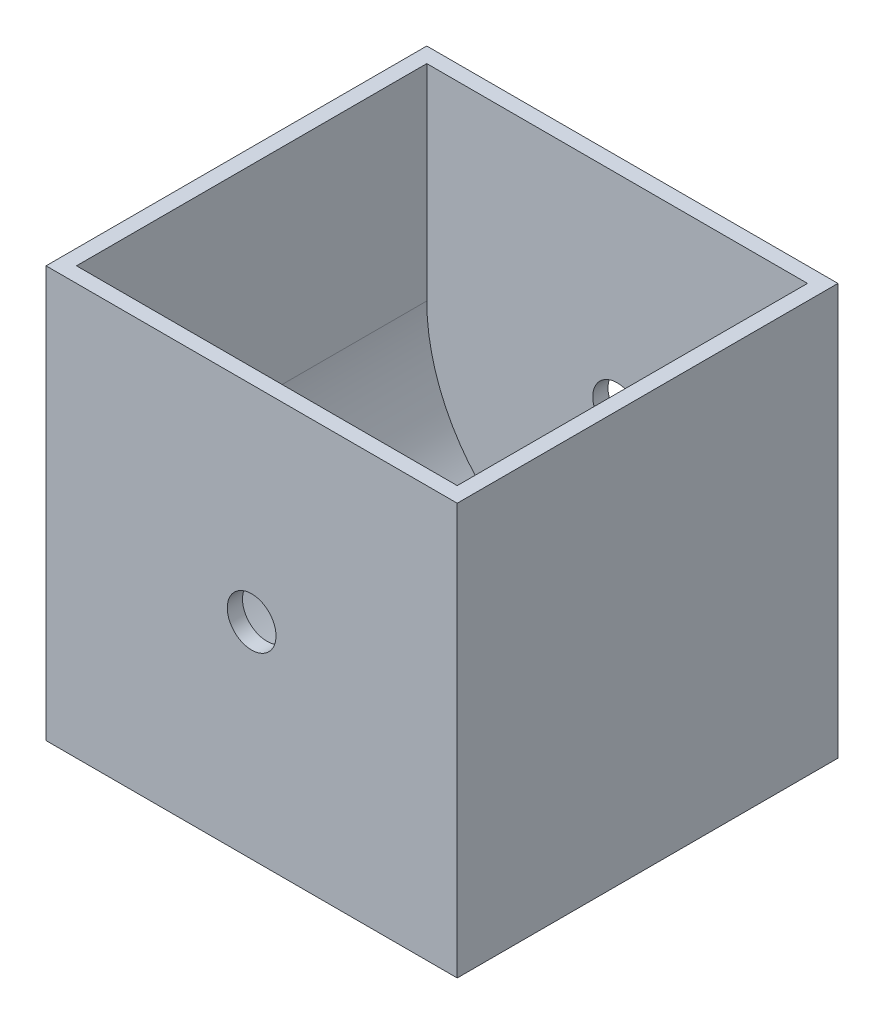
ISO-10303-21;
HEADER;
FILE_DESCRIPTION(('STEP AP214'),'2;1');
FILE_NAME('part.step','',(''),(''),'','','');
FILE_SCHEMA(('AUTOMOTIVE_DESIGN { 1 0 10303 214 1 1 1 1 }'));
ENDSEC;
DATA;
#1=APPLICATION_CONTEXT('core data for automotive mechanical design processes');
#2=APPLICATION_PROTOCOL_DEFINITION('international standard','automotive_design',2000,#1);
#3=PRODUCT_CONTEXT('',#1,'mechanical');
#4=PRODUCT('Part','Part','',(#3));
#5=PRODUCT_RELATED_PRODUCT_CATEGORY('part','',(#4));
#6=PRODUCT_DEFINITION_FORMATION('','',#4);
#7=PRODUCT_DEFINITION_CONTEXT('part definition',#1,'design');
#8=PRODUCT_DEFINITION('design','',#6,#7);
#9=PRODUCT_DEFINITION_SHAPE('','',#8);
#10=(LENGTH_UNIT() NAMED_UNIT(*) SI_UNIT(.MILLI.,.METRE.));
#11=(NAMED_UNIT(*) PLANE_ANGLE_UNIT() SI_UNIT($,.RADIAN.));
#12=(NAMED_UNIT(*) SI_UNIT($,.STERADIAN.) SOLID_ANGLE_UNIT());
#13=UNCERTAINTY_MEASURE_WITH_UNIT(LENGTH_MEASURE(1.E-05),#10,'distance_accuracy_value','');
#14=(GEOMETRIC_REPRESENTATION_CONTEXT(3) GLOBAL_UNCERTAINTY_ASSIGNED_CONTEXT((#13)) GLOBAL_UNIT_ASSIGNED_CONTEXT((#10,
#11,#12)) REPRESENTATION_CONTEXT('',''));
#15=CARTESIAN_POINT('',(0.,0.,0.));
#16=DIRECTION('',(0.,0.,1.));
#17=DIRECTION('',(1.,0.,0.));
#18=AXIS2_PLACEMENT_3D('',#15,#16,#17);
#19=CARTESIAN_POINT('',(0.,0.,-5.));
#20=DIRECTION('',(0.,-1.,0.));
#21=DIRECTION('',(1.,0.,0.));
#22=AXIS2_PLACEMENT_3D('',#19,#20,#21);
#23=PLANE('',#22);
#24=DIRECTION('',(0.,0.,1.));
#25=VECTOR('',#24,1.);
#26=CARTESIAN_POINT('',(135.,0.,-5.));
#27=LINE('',#26,#25);
#28=CARTESIAN_POINT('',(135.,0.,-5.));
#29=VERTEX_POINT('',#28);
#30=CARTESIAN_POINT('',(135.,0.,120.));
#31=VERTEX_POINT('',#30);
#32=EDGE_CURVE('E177',#29,#31,#27,.T.);
#33=ORIENTED_EDGE('',*,*,#32,.T.);
#34=DIRECTION('',(1.,0.,0.));
#35=VECTOR('',#34,1.);
#36=CARTESIAN_POINT('',(0.,0.,120.));
#37=LINE('',#36,#35);
#38=CARTESIAN_POINT('',(0.,0.,120.));
#39=VERTEX_POINT('',#38);
#40=EDGE_CURVE('E151',#39,#31,#37,.T.);
#41=ORIENTED_EDGE('',*,*,#40,.F.);
#42=DIRECTION('',(0.,0.,1.));
#43=VECTOR('',#42,1.);
#44=CARTESIAN_POINT('',(0.,0.,-5.));
#45=LINE('',#44,#43);
#46=CARTESIAN_POINT('',(0.,0.,-5.));
#47=VERTEX_POINT('',#46);
#48=EDGE_CURVE('E12',#47,#39,#45,.T.);
#49=ORIENTED_EDGE('',*,*,#48,.F.);
#50=DIRECTION('',(1.,0.,0.));
#51=VECTOR('',#50,1.);
#52=CARTESIAN_POINT('',(0.,0.,-5.));
#53=LINE('',#52,#51);
#54=EDGE_CURVE('E167',#47,#29,#53,.T.);
#55=ORIENTED_EDGE('',*,*,#54,.T.);
#56=EDGE_LOOP('',(#33,#41,#49,#55));
#57=FACE_BOUND('',#56,.T.);
#58=ADVANCED_FACE('F54',(#57),#23,.T.);
#59=CARTESIAN_POINT('',(0.,0.,-5.));
#60=DIRECTION('',(1.,0.,0.));
#61=DIRECTION('',(0.,0.,-1.));
#62=AXIS2_PLACEMENT_3D('',#59,#60,#61);
#63=PLANE('',#62);
#64=ORIENTED_EDGE('',*,*,#48,.T.);
#65=DIRECTION('',(0.,1.,0.));
#66=VECTOR('',#65,1.);
#67=CARTESIAN_POINT('',(0.,0.,120.));
#68=LINE('',#67,#66);
#69=CARTESIAN_POINT('',(0.,135.,120.));
#70=VERTEX_POINT('',#69);
#71=EDGE_CURVE('E160',#39,#70,#68,.T.);
#72=ORIENTED_EDGE('',*,*,#71,.T.);
#73=DIRECTION('',(0.,0.,1.));
#74=VECTOR('',#73,1.);
#75=CARTESIAN_POINT('',(0.,135.,-5.));
#76=LINE('',#75,#74);
#77=CARTESIAN_POINT('',(0.,135.,-5.));
#78=VERTEX_POINT('',#77);
#79=EDGE_CURVE('E63',#78,#70,#76,.T.);
#80=ORIENTED_EDGE('',*,*,#79,.F.);
#81=DIRECTION('',(0.,1.,0.));
#82=VECTOR('',#81,1.);
#83=CARTESIAN_POINT('',(0.,0.,-5.));
#84=LINE('',#83,#82);
#85=EDGE_CURVE('E174',#47,#78,#84,.T.);
#86=ORIENTED_EDGE('',*,*,#85,.F.);
#87=EDGE_LOOP('',(#64,#72,#80,#86));
#88=FACE_BOUND('',#87,.T.);
#89=ADVANCED_FACE('F194',(#88),#63,.F.);
#90=CARTESIAN_POINT('',(0.,135.,-5.));
#91=DIRECTION('',(0.,-1.,0.));
#92=DIRECTION('',(1.,0.,0.));
#93=AXIS2_PLACEMENT_3D('',#90,#91,#92);
#94=PLANE('',#93);
#95=DIRECTION('',(0.,0.,1.));
#96=VECTOR('',#95,1.);
#97=CARTESIAN_POINT('',(5.00000000000002,135.,0.));
#98=LINE('',#97,#96);
#99=CARTESIAN_POINT('',(5.00000000000002,135.,0.));
#100=VERTEX_POINT('',#99);
#101=CARTESIAN_POINT('',(5.00000000000002,135.,115.));
#102=VERTEX_POINT('',#101);
#103=EDGE_CURVE('E142',#100,#102,#98,.T.);
#104=ORIENTED_EDGE('',*,*,#103,.F.);
#105=DIRECTION('',(-1.,0.,0.));
#106=VECTOR('',#105,1.);
#107=CARTESIAN_POINT('',(130.,135.,0.));
#108=LINE('',#107,#106);
#109=CARTESIAN_POINT('',(130.,135.,0.));
#110=VERTEX_POINT('',#109);
#111=EDGE_CURVE('E71',#110,#100,#108,.T.);
#112=ORIENTED_EDGE('',*,*,#111,.F.);
#113=DIRECTION('',(0.,0.,1.));
#114=VECTOR('',#113,1.);
#115=CARTESIAN_POINT('',(130.,135.,0.));
#116=LINE('',#115,#114);
#117=CARTESIAN_POINT('',(130.,135.,115.));
#118=VERTEX_POINT('',#117);
#119=EDGE_CURVE('E130',#110,#118,#116,.T.);
#120=ORIENTED_EDGE('',*,*,#119,.T.);
#121=DIRECTION('',(-1.,0.,0.));
#122=VECTOR('',#121,1.);
#123=CARTESIAN_POINT('',(130.,135.,115.));
#124=LINE('',#123,#122);
#125=EDGE_CURVE('E255',#118,#102,#124,.T.);
#126=ORIENTED_EDGE('',*,*,#125,.T.);
#127=EDGE_LOOP('',(#104,#112,#120,#126));
#128=FACE_BOUND('',#127,.T.);
#129=ORIENTED_EDGE('',*,*,#79,.T.);
#130=DIRECTION('',(1.,0.,0.));
#131=VECTOR('',#130,1.);
#132=CARTESIAN_POINT('',(0.,135.,120.));
#133=LINE('',#132,#131);
#134=CARTESIAN_POINT('',(135.,135.,120.));
#135=VERTEX_POINT('',#134);
#136=EDGE_CURVE('E157',#70,#135,#133,.T.);
#137=ORIENTED_EDGE('',*,*,#136,.T.);
#138=DIRECTION('',(0.,0.,1.));
#139=VECTOR('',#138,1.);
#140=CARTESIAN_POINT('',(135.,135.,-5.));
#141=LINE('',#140,#139);
#142=CARTESIAN_POINT('',(135.,135.,-5.));
#143=VERTEX_POINT('',#142);
#144=EDGE_CURVE('E181',#143,#135,#141,.T.);
#145=ORIENTED_EDGE('',*,*,#144,.F.);
#146=DIRECTION('',(1.,0.,0.));
#147=VECTOR('',#146,1.);
#148=CARTESIAN_POINT('',(0.,135.,-5.));
#149=LINE('',#148,#147);
#150=EDGE_CURVE('E172',#78,#143,#149,.T.);
#151=ORIENTED_EDGE('',*,*,#150,.F.);
#152=EDGE_LOOP('',(#129,#137,#145,#151));
#153=FACE_BOUND('',#152,.T.);
#154=ADVANCED_FACE('F198',(#128,#153),#94,.F.);
#155=CARTESIAN_POINT('',(67.5,67.5,-5.));
#156=DIRECTION('',(0.,0.,1.));
#157=DIRECTION('',(1.,0.,0.));
#158=AXIS2_PLACEMENT_3D('',#155,#156,#157);
#159=CYLINDRICAL_SURFACE('',#158,7.99999999999999);
#160=CARTESIAN_POINT('',(67.5,67.5,-5.));
#161=DIRECTION('',(0.,0.,1.));
#162=DIRECTION('',(1.,0.,0.));
#163=AXIS2_PLACEMENT_3D('',#160,#161,#162);
#164=CIRCLE('',#163,7.99999999999999);
#165=CARTESIAN_POINT('',(75.5,67.5,-5.));
#166=VERTEX_POINT('',#165);
#167=EDGE_CURVE('E164',#166,#166,#164,.T.);
#168=ORIENTED_EDGE('',*,*,#167,.F.);
#169=EDGE_LOOP('',(#168));
#170=FACE_BOUND('',#169,.T.);
#171=CARTESIAN_POINT('',(67.5,67.5,0.));
#172=DIRECTION('',(0.,0.,1.));
#173=DIRECTION('',(1.,0.,0.));
#174=AXIS2_PLACEMENT_3D('',#171,#172,#173);
#175=CIRCLE('',#174,7.99999999999999);
#176=CARTESIAN_POINT('',(75.5,67.5,0.));
#177=VERTEX_POINT('',#176);
#178=EDGE_CURVE('E163',#177,#177,#175,.T.);
#179=ORIENTED_EDGE('',*,*,#178,.T.);
#180=EDGE_LOOP('',(#179));
#181=FACE_BOUND('',#180,.T.);
#182=ADVANCED_FACE('F56',(#170,#181),#159,.F.);
#183=CARTESIAN_POINT('',(135.,0.,-5.));
#184=DIRECTION('',(1.,0.,0.));
#185=DIRECTION('',(0.,1.,0.));
#186=AXIS2_PLACEMENT_3D('',#183,#184,#185);
#187=PLANE('',#186);
#188=ORIENTED_EDGE('',*,*,#144,.T.);
#189=DIRECTION('',(0.,1.,0.));
#190=VECTOR('',#189,1.);
#191=CARTESIAN_POINT('',(135.,0.,120.));
#192=LINE('',#191,#190);
#193=EDGE_CURVE('E154',#31,#135,#192,.T.);
#194=ORIENTED_EDGE('',*,*,#193,.F.);
#195=ORIENTED_EDGE('',*,*,#32,.F.);
#196=DIRECTION('',(0.,1.,0.));
#197=VECTOR('',#196,1.);
#198=CARTESIAN_POINT('',(135.,0.,-5.));
#199=LINE('',#198,#197);
#200=EDGE_CURVE('E169',#29,#143,#199,.T.);
#201=ORIENTED_EDGE('',*,*,#200,.T.);
#202=EDGE_LOOP('',(#188,#194,#195,#201));
#203=FACE_BOUND('',#202,.T.);
#204=ADVANCED_FACE('F187',(#203),#187,.T.);
#205=CARTESIAN_POINT('',(0.,0.,-5.));
#206=DIRECTION('',(0.,0.,1.));
#207=DIRECTION('',(1.,0.,0.));
#208=AXIS2_PLACEMENT_3D('',#205,#206,#207);
#209=PLANE('',#208);
#210=ORIENTED_EDGE('',*,*,#167,.T.);
#211=EDGE_LOOP('',(#210));
#212=FACE_BOUND('',#211,.T.);
#213=ORIENTED_EDGE('',*,*,#54,.F.);
#214=ORIENTED_EDGE('',*,*,#85,.T.);
#215=ORIENTED_EDGE('',*,*,#150,.T.);
#216=ORIENTED_EDGE('',*,*,#200,.F.);
#217=EDGE_LOOP('',(#213,#214,#215,#216));
#218=FACE_BOUND('',#217,.T.);
#219=ADVANCED_FACE('F196',(#212,#218),#209,.F.);
#220=CARTESIAN_POINT('',(0.,0.,120.));
#221=DIRECTION('',(0.,0.,1.));
#222=DIRECTION('',(1.,0.,0.));
#223=AXIS2_PLACEMENT_3D('',#220,#221,#222);
#224=PLANE('',#223);
#225=CARTESIAN_POINT('',(67.5,67.5,120.));
#226=DIRECTION('',(0.,0.,1.));
#227=DIRECTION('',(1.,0.,0.));
#228=AXIS2_PLACEMENT_3D('',#225,#226,#227);
#229=CIRCLE('',#228,7.99999999999999);
#230=CARTESIAN_POINT('',(75.5,67.5,120.));
#231=VERTEX_POINT('',#230);
#232=EDGE_CURVE('E248',#231,#231,#229,.T.);
#233=ORIENTED_EDGE('',*,*,#232,.F.);
#234=EDGE_LOOP('',(#233));
#235=FACE_BOUND('',#234,.T.);
#236=ORIENTED_EDGE('',*,*,#40,.T.);
#237=ORIENTED_EDGE('',*,*,#193,.T.);
#238=ORIENTED_EDGE('',*,*,#136,.F.);
#239=ORIENTED_EDGE('',*,*,#71,.F.);
#240=EDGE_LOOP('',(#236,#237,#238,#239));
#241=FACE_BOUND('',#240,.T.);
#242=ADVANCED_FACE('F191',(#235,#241),#224,.T.);
#243=CARTESIAN_POINT('',(130.,67.5,0.));
#244=DIRECTION('',(0.,0.,-1.));
#245=DIRECTION('',(-1.,0.,0.));
#246=AXIS2_PLACEMENT_3D('',#243,#244,#245);
#247=PLANE('',#246);
#248=DIRECTION('',(0.,1.,0.));
#249=VECTOR('',#248,1.);
#250=CARTESIAN_POINT('',(5.00000000000003,67.5,0.));
#251=LINE('',#250,#249);
#252=CARTESIAN_POINT('',(5.00000000000002,67.5,0.));
#253=VERTEX_POINT('',#252);
#254=EDGE_CURVE('E144',#253,#100,#251,.T.);
#255=ORIENTED_EDGE('',*,*,#254,.F.);
#256=CARTESIAN_POINT('',(67.5,67.5,0.));
#257=DIRECTION('',(0.,0.,1.));
#258=DIRECTION('',(1.,0.,0.));
#259=AXIS2_PLACEMENT_3D('',#256,#257,#258);
#260=CIRCLE('',#259,62.5);
#261=CARTESIAN_POINT('',(130.,67.5,0.));
#262=VERTEX_POINT('',#261);
#263=EDGE_CURVE('E126',#253,#262,#260,.T.);
#264=ORIENTED_EDGE('',*,*,#263,.T.);
#265=DIRECTION('',(0.,1.,0.));
#266=VECTOR('',#265,1.);
#267=CARTESIAN_POINT('',(130.,67.5,0.));
#268=LINE('',#267,#266);
#269=EDGE_CURVE('E146',#262,#110,#268,.T.);
#270=ORIENTED_EDGE('',*,*,#269,.T.);
#271=ORIENTED_EDGE('',*,*,#111,.T.);
#272=EDGE_LOOP('',(#255,#264,#270,#271));
#273=FACE_BOUND('',#272,.T.);
#274=ORIENTED_EDGE('',*,*,#178,.F.);
#275=EDGE_LOOP('',(#274));
#276=FACE_BOUND('',#275,.T.);
#277=ADVANCED_FACE('F221',(#273,#276),#247,.F.);
#278=CARTESIAN_POINT('',(130.,67.5,0.));
#279=DIRECTION('',(-1.,0.,0.));
#280=DIRECTION('',(0.,-1.,0.));
#281=AXIS2_PLACEMENT_3D('',#278,#279,#280);
#282=PLANE('',#281);
#283=ORIENTED_EDGE('',*,*,#119,.F.);
#284=ORIENTED_EDGE('',*,*,#269,.F.);
#285=DIRECTION('',(0.,0.,1.));
#286=VECTOR('',#285,1.);
#287=CARTESIAN_POINT('',(130.,67.5,0.));
#288=LINE('',#287,#286);
#289=CARTESIAN_POINT('',(130.,67.5,115.));
#290=VERTEX_POINT('',#289);
#291=EDGE_CURVE('E129',#262,#290,#288,.T.);
#292=ORIENTED_EDGE('',*,*,#291,.T.);
#293=DIRECTION('',(0.,1.,0.));
#294=VECTOR('',#293,1.);
#295=CARTESIAN_POINT('',(130.,67.5,115.));
#296=LINE('',#295,#294);
#297=EDGE_CURVE('E138',#290,#118,#296,.T.);
#298=ORIENTED_EDGE('',*,*,#297,.T.);
#299=EDGE_LOOP('',(#283,#284,#292,#298));
#300=FACE_BOUND('',#299,.T.);
#301=ADVANCED_FACE('F227',(#300),#282,.T.);
#302=CARTESIAN_POINT('',(130.,67.5,115.));
#303=DIRECTION('',(0.,0.,-1.));
#304=DIRECTION('',(-1.,0.,0.));
#305=AXIS2_PLACEMENT_3D('',#302,#303,#304);
#306=PLANE('',#305);
#307=CARTESIAN_POINT('',(67.5,67.5,115.));
#308=DIRECTION('',(0.,0.,-1.));
#309=DIRECTION('',(-1.,0.,0.));
#310=AXIS2_PLACEMENT_3D('',#307,#308,#309);
#311=CIRCLE('',#310,7.99999999999999);
#312=CARTESIAN_POINT('',(59.5,67.5,115.));
#313=VERTEX_POINT('',#312);
#314=EDGE_CURVE('E58',#313,#313,#311,.F.);
#315=ORIENTED_EDGE('',*,*,#314,.T.);
#316=EDGE_LOOP('',(#315));
#317=FACE_BOUND('',#316,.T.);
#318=ORIENTED_EDGE('',*,*,#297,.F.);
#319=CARTESIAN_POINT('',(67.5,67.5,115.));
#320=DIRECTION('',(0.,0.,1.));
#321=DIRECTION('',(1.,0.,0.));
#322=AXIS2_PLACEMENT_3D('',#319,#320,#321);
#323=CIRCLE('',#322,62.5);
#324=CARTESIAN_POINT('',(5.00000000000002,67.5,115.));
#325=VERTEX_POINT('',#324);
#326=EDGE_CURVE('E123',#325,#290,#323,.T.);
#327=ORIENTED_EDGE('',*,*,#326,.F.);
#328=DIRECTION('',(0.,1.,0.));
#329=VECTOR('',#328,1.);
#330=CARTESIAN_POINT('',(5.00000000000003,67.5,115.));
#331=LINE('',#330,#329);
#332=EDGE_CURVE('E136',#325,#102,#331,.T.);
#333=ORIENTED_EDGE('',*,*,#332,.T.);
#334=ORIENTED_EDGE('',*,*,#125,.F.);
#335=EDGE_LOOP('',(#318,#327,#333,#334));
#336=FACE_BOUND('',#335,.T.);
#337=ADVANCED_FACE('F134',(#317,#336),#306,.T.);
#338=CARTESIAN_POINT('',(5.00000000000003,67.5,0.));
#339=DIRECTION('',(-1.,0.,0.));
#340=DIRECTION('',(0.,-1.,0.));
#341=AXIS2_PLACEMENT_3D('',#338,#339,#340);
#342=PLANE('',#341);
#343=ORIENTED_EDGE('',*,*,#103,.T.);
#344=ORIENTED_EDGE('',*,*,#332,.F.);
#345=DIRECTION('',(0.,0.,1.));
#346=VECTOR('',#345,1.);
#347=CARTESIAN_POINT('',(5.00000000000003,67.5,0.));
#348=LINE('',#347,#346);
#349=EDGE_CURVE('E120',#253,#325,#348,.T.);
#350=ORIENTED_EDGE('',*,*,#349,.F.);
#351=ORIENTED_EDGE('',*,*,#254,.T.);
#352=EDGE_LOOP('',(#343,#344,#350,#351));
#353=FACE_BOUND('',#352,.T.);
#354=ADVANCED_FACE('F140',(#353),#342,.F.);
#355=CARTESIAN_POINT('',(67.5,67.5,115.));
#356=DIRECTION('',(0.,0.,-1.));
#357=DIRECTION('',(-1.,0.,0.));
#358=AXIS2_PLACEMENT_3D('',#355,#356,#357);
#359=CYLINDRICAL_SURFACE('',#358,62.5);
#360=ORIENTED_EDGE('',*,*,#263,.F.);
#361=ORIENTED_EDGE('',*,*,#349,.T.);
#362=ORIENTED_EDGE('',*,*,#326,.T.);
#363=ORIENTED_EDGE('',*,*,#291,.F.);
#364=EDGE_LOOP('',(#360,#361,#362,#363));
#365=FACE_BOUND('',#364,.T.);
#366=ADVANCED_FACE('F122',(#365),#359,.F.);
#367=CARTESIAN_POINT('',(67.5,67.5,120.));
#368=DIRECTION('',(0.,0.,-1.));
#369=DIRECTION('',(-1.,0.,0.));
#370=AXIS2_PLACEMENT_3D('',#367,#368,#369);
#371=CYLINDRICAL_SURFACE('',#370,7.99999999999999);
#372=ORIENTED_EDGE('',*,*,#314,.F.);
#373=EDGE_LOOP('',(#372));
#374=FACE_BOUND('',#373,.T.);
#375=ORIENTED_EDGE('',*,*,#232,.T.);
#376=EDGE_LOOP('',(#375));
#377=FACE_BOUND('',#376,.T.);
#378=ADVANCED_FACE('F238',(#374,#377),#371,.F.);
#379=CLOSED_SHELL('',(#58,#89,#154,#182,#204,#219,#242,#277,#301,#337,#354,#366,#378));
#380=MANIFOLD_SOLID_BREP('B2',#379);
#381=ADVANCED_BREP_SHAPE_REPRESENTATION('',(#18,#380),#14);
#382=SHAPE_DEFINITION_REPRESENTATION(#9,#381);
ENDSEC;
END-ISO-10303-21;
